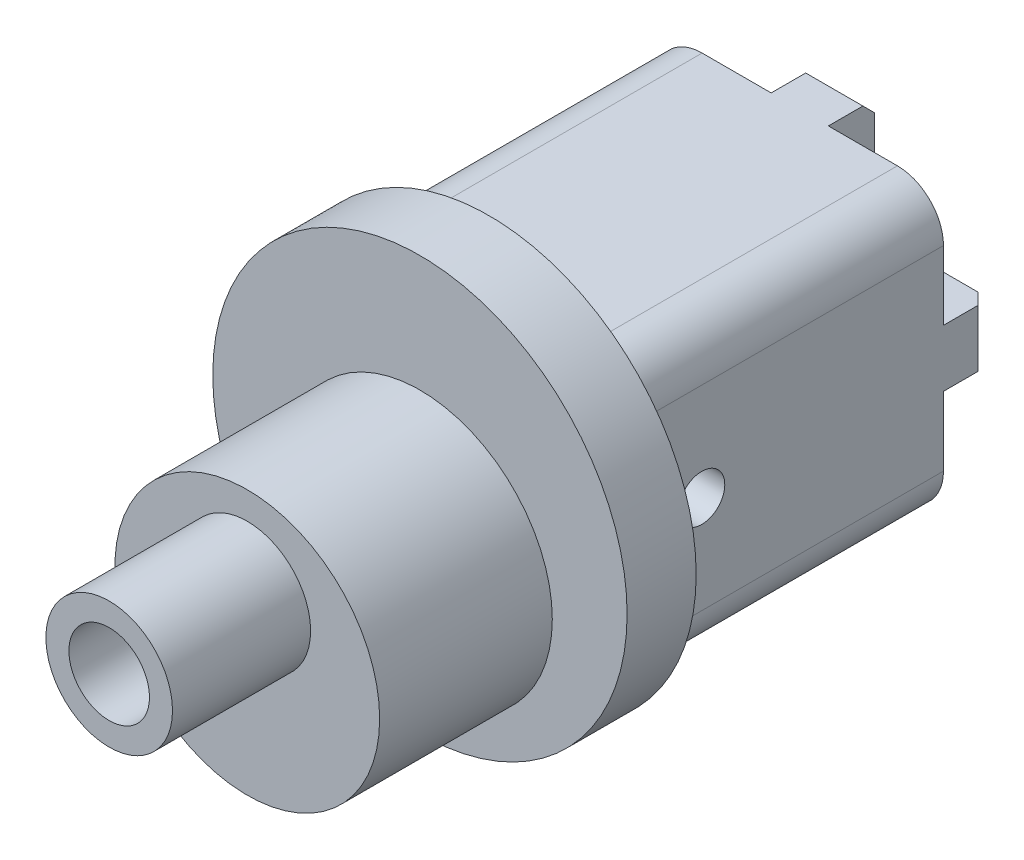
ISO-10303-21;
HEADER;
FILE_DESCRIPTION(('STEP AP214'),'2;1');
FILE_NAME('part.step','',(''),(''),'','','');
FILE_SCHEMA(('AUTOMOTIVE_DESIGN { 1 0 10303 214 1 1 1 1 }'));
ENDSEC;
DATA;
#1=APPLICATION_CONTEXT('core data for automotive mechanical design processes');
#2=APPLICATION_PROTOCOL_DEFINITION('international standard','automotive_design',2000,#1);
#3=PRODUCT_CONTEXT('',#1,'mechanical');
#4=PRODUCT('Part','Part','',(#3));
#5=PRODUCT_RELATED_PRODUCT_CATEGORY('part','',(#4));
#6=PRODUCT_DEFINITION_FORMATION('','',#4);
#7=PRODUCT_DEFINITION_CONTEXT('part definition',#1,'design');
#8=PRODUCT_DEFINITION('design','',#6,#7);
#9=PRODUCT_DEFINITION_SHAPE('','',#8);
#10=(LENGTH_UNIT() NAMED_UNIT(*) SI_UNIT(.MILLI.,.METRE.));
#11=(NAMED_UNIT(*) PLANE_ANGLE_UNIT() SI_UNIT($,.RADIAN.));
#12=(NAMED_UNIT(*) SI_UNIT($,.STERADIAN.) SOLID_ANGLE_UNIT());
#13=UNCERTAINTY_MEASURE_WITH_UNIT(LENGTH_MEASURE(1.E-05),#10,'distance_accuracy_value','');
#14=(GEOMETRIC_REPRESENTATION_CONTEXT(3) GLOBAL_UNCERTAINTY_ASSIGNED_CONTEXT((#13)) GLOBAL_UNIT_ASSIGNED_CONTEXT((#10,
#11,#12)) REPRESENTATION_CONTEXT('',''));
#15=CARTESIAN_POINT('',(0.,0.,0.));
#16=DIRECTION('',(0.,0.,1.));
#17=DIRECTION('',(1.,0.,0.));
#18=AXIS2_PLACEMENT_3D('',#15,#16,#17);
#19=CARTESIAN_POINT('',(0.,0.,2.));
#20=DIRECTION('',(0.,0.,1.));
#21=DIRECTION('',(1.,0.,0.));
#22=AXIS2_PLACEMENT_3D('',#19,#20,#21);
#23=PLANE('',#22);
#24=DIRECTION('',(-1.,0.,0.));
#25=VECTOR('',#24,1.);
#26=CARTESIAN_POINT('',(0.,-1.24264068719723,2.));
#27=LINE('',#26,#25);
#28=CARTESIAN_POINT('',(-4.24264068669562,-1.24264068719723,2.));
#29=VERTEX_POINT('',#28);
#30=CARTESIAN_POINT('',(-6.24264068701273,-1.24264068719723,2.));
#31=VERTEX_POINT('',#30);
#32=EDGE_CURVE('E605',#29,#31,#27,.T.);
#33=ORIENTED_EDGE('',*,*,#32,.F.);
#34=CARTESIAN_POINT('',(-4.24264068669562,-4.24264068701051,2.));
#35=DIRECTION('',(0.,0.,1.));
#36=DIRECTION('',(1.,0.,0.));
#37=AXIS2_PLACEMENT_3D('',#34,#35,#36);
#38=CIRCLE('',#37,2.99999999981328);
#39=CARTESIAN_POINT('',(-1.24264068688234,-4.24264068701051,2.));
#40=VERTEX_POINT('',#39);
#41=EDGE_CURVE('E602',#40,#29,#38,.T.);
#42=ORIENTED_EDGE('',*,*,#41,.F.);
#43=DIRECTION('',(0.,-1.,0.));
#44=VECTOR('',#43,1.);
#45=CARTESIAN_POINT('',(-1.24264068688233,0.,2.));
#46=LINE('',#45,#44);
#47=CARTESIAN_POINT('',(-1.24264068688234,-6.24264068669785,2.));
#48=VERTEX_POINT('',#47);
#49=EDGE_CURVE('E600',#40,#48,#46,.T.);
#50=ORIENTED_EDGE('',*,*,#49,.T.);
#51=DIRECTION('',(-1.,0.,0.));
#52=VECTOR('',#51,1.);
#53=CARTESIAN_POINT('',(0.,-6.24264068669785,2.));
#54=LINE('',#53,#52);
#55=CARTESIAN_POINT('',(-4.2426406870109,-6.24264068651041,2.));
#56=VERTEX_POINT('',#55);
#57=EDGE_CURVE('E378',#48,#56,#54,.T.);
#58=ORIENTED_EDGE('',*,*,#57,.T.);
#59=CARTESIAN_POINT('',(-4.2426406870109,-4.24264068669601,2.));
#60=DIRECTION('',(0.,0.,1.));
#61=DIRECTION('',(1.,0.,0.));
#62=AXIS2_PLACEMENT_3D('',#59,#60,#61);
#63=CIRCLE('',#62,1.99999999962697);
#64=CARTESIAN_POINT('',(-6.2426406868253,-4.24264068669601,2.));
#65=VERTEX_POINT('',#64);
#66=EDGE_CURVE('E375',#65,#56,#63,.T.);
#67=ORIENTED_EDGE('',*,*,#66,.F.);
#68=DIRECTION('',(0.,-1.,0.));
#69=VECTOR('',#68,1.);
#70=CARTESIAN_POINT('',(-6.24264068701273,0.,2.));
#71=LINE('',#70,#69);
#72=EDGE_CURVE('E352',#31,#65,#71,.T.);
#73=ORIENTED_EDGE('',*,*,#72,.F.);
#74=EDGE_LOOP('',(#33,#42,#50,#58,#67,#73));
#75=FACE_BOUND('',#74,.T.);
#76=ADVANCED_FACE('F65',(#75),#23,.F.);
#77=DIRECTION('',(0.,-1.,0.));
#78=VECTOR('',#77,1.);
#79=CARTESIAN_POINT('',(1.24264068719723,0.,2.));
#80=LINE('',#79,#78);
#81=CARTESIAN_POINT('',(1.24264068719723,-4.24264068669562,2.));
#82=VERTEX_POINT('',#81);
#83=CARTESIAN_POINT('',(1.24264068719723,-6.24264068669785,2.));
#84=VERTEX_POINT('',#83);
#85=EDGE_CURVE('E597',#82,#84,#80,.T.);
#86=ORIENTED_EDGE('',*,*,#85,.F.);
#87=CARTESIAN_POINT('',(4.24264068701051,-4.24264068669562,2.));
#88=DIRECTION('',(0.,0.,1.));
#89=DIRECTION('',(1.,0.,0.));
#90=AXIS2_PLACEMENT_3D('',#87,#88,#89);
#91=CIRCLE('',#90,2.99999999981328);
#92=CARTESIAN_POINT('',(4.24264068701051,-1.24264068688234,2.));
#93=VERTEX_POINT('',#92);
#94=EDGE_CURVE('E592',#93,#82,#91,.T.);
#95=ORIENTED_EDGE('',*,*,#94,.F.);
#96=DIRECTION('',(1.,0.,0.));
#97=VECTOR('',#96,1.);
#98=CARTESIAN_POINT('',(0.,-1.24264068688234,2.));
#99=LINE('',#98,#97);
#100=CARTESIAN_POINT('',(6.24264068669746,-1.24264068688234,2.));
#101=VERTEX_POINT('',#100);
#102=EDGE_CURVE('E590',#93,#101,#99,.T.);
#103=ORIENTED_EDGE('',*,*,#102,.T.);
#104=DIRECTION('',(0.,-1.,0.));
#105=VECTOR('',#104,1.);
#106=CARTESIAN_POINT('',(6.24264068669746,0.,2.));
#107=LINE('',#106,#105);
#108=CARTESIAN_POINT('',(6.24264068655586,-4.24264068669601,2.));
#109=VERTEX_POINT('',#108);
#110=EDGE_CURVE('E384',#101,#109,#107,.T.);
#111=ORIENTED_EDGE('',*,*,#110,.T.);
#112=CARTESIAN_POINT('',(4.24264068669562,-4.24264068669601,2.));
#113=DIRECTION('',(0.,0.,1.));
#114=DIRECTION('',(1.,0.,0.));
#115=AXIS2_PLACEMENT_3D('',#112,#113,#114);
#116=CIRCLE('',#115,1.99999999971864);
#117=CARTESIAN_POINT('',(4.24264068669562,-6.24264068655625,2.));
#118=VERTEX_POINT('',#117);
#119=EDGE_CURVE('E381',#118,#109,#116,.T.);
#120=ORIENTED_EDGE('',*,*,#119,.F.);
#121=EDGE_CURVE('E379',#118,#84,#54,.T.);
#122=ORIENTED_EDGE('',*,*,#121,.T.);
#123=EDGE_LOOP('',(#86,#95,#103,#111,#120,#122));
#124=FACE_BOUND('',#123,.T.);
#125=ADVANCED_FACE('F475',(#124),#23,.F.);
#126=DIRECTION('',(1.,0.,0.));
#127=VECTOR('',#126,1.);
#128=CARTESIAN_POINT('',(0.,1.24264068719723,2.));
#129=LINE('',#128,#127);
#130=CARTESIAN_POINT('',(4.24264068669562,1.24264068719723,2.));
#131=VERTEX_POINT('',#130);
#132=CARTESIAN_POINT('',(6.24264068669746,1.24264068719723,2.));
#133=VERTEX_POINT('',#132);
#134=EDGE_CURVE('E589',#131,#133,#129,.T.);
#135=ORIENTED_EDGE('',*,*,#134,.F.);
#136=CARTESIAN_POINT('',(4.24264068669562,4.24264068701051,2.));
#137=DIRECTION('',(0.,0.,1.));
#138=DIRECTION('',(1.,0.,0.));
#139=AXIS2_PLACEMENT_3D('',#136,#137,#138);
#140=CIRCLE('',#139,2.99999999981328);
#141=CARTESIAN_POINT('',(1.24264068688234,4.24264068701051,2.));
#142=VERTEX_POINT('',#141);
#143=EDGE_CURVE('E278',#142,#131,#140,.T.);
#144=ORIENTED_EDGE('',*,*,#143,.F.);
#145=DIRECTION('',(0.,1.,0.));
#146=VECTOR('',#145,1.);
#147=CARTESIAN_POINT('',(1.24264068688234,0.,2.));
#148=LINE('',#147,#146);
#149=CARTESIAN_POINT('',(1.24264068688234,6.24264068701235,2.));
#150=VERTEX_POINT('',#149);
#151=EDGE_CURVE('E275',#142,#150,#148,.T.);
#152=ORIENTED_EDGE('',*,*,#151,.T.);
#153=DIRECTION('',(-1.,0.,0.));
#154=VECTOR('',#153,1.);
#155=CARTESIAN_POINT('',(0.,6.24264068701235,2.));
#156=LINE('',#155,#154);
#157=CARTESIAN_POINT('',(4.24264068669562,6.24264068702136,2.));
#158=VERTEX_POINT('',#157);
#159=EDGE_CURVE('E261',#158,#150,#156,.T.);
#160=ORIENTED_EDGE('',*,*,#159,.F.);
#161=CARTESIAN_POINT('',(4.24264068669562,4.24264068701051,2.));
#162=DIRECTION('',(0.,0.,1.));
#163=DIRECTION('',(1.,0.,0.));
#164=AXIS2_PLACEMENT_3D('',#161,#162,#163);
#165=CIRCLE('',#164,2.00000000001987);
#166=CARTESIAN_POINT('',(6.24264068670647,4.24264068701051,2.));
#167=VERTEX_POINT('',#166);
#168=EDGE_CURVE('E262',#167,#158,#165,.T.);
#169=ORIENTED_EDGE('',*,*,#168,.F.);
#170=EDGE_CURVE('E385',#167,#133,#107,.T.);
#171=ORIENTED_EDGE('',*,*,#170,.T.);
#172=EDGE_LOOP('',(#135,#144,#152,#160,#169,#171));
#173=FACE_BOUND('',#172,.T.);
#174=ADVANCED_FACE('F481',(#173),#23,.F.);
#175=CARTESIAN_POINT('',(0.,0.,18.5));
#176=DIRECTION('',(0.,0.,-1.));
#177=DIRECTION('',(-1.,0.,0.));
#178=AXIS2_PLACEMENT_3D('',#175,#176,#177);
#179=CYLINDRICAL_SURFACE('',#178,9.);
#180=CARTESIAN_POINT('',(0.,0.,18.5));
#181=DIRECTION('',(0.,0.,1.));
#182=DIRECTION('',(1.,0.,0.));
#183=AXIS2_PLACEMENT_3D('',#180,#181,#182);
#184=CIRCLE('',#183,9.);
#185=CARTESIAN_POINT('',(9.,0.,18.5));
#186=VERTEX_POINT('',#185);
#187=EDGE_CURVE('E424',#186,#186,#184,.T.);
#188=ORIENTED_EDGE('',*,*,#187,.F.);
#189=EDGE_LOOP('',(#188));
#190=FACE_BOUND('',#189,.T.);
#191=CARTESIAN_POINT('',(0.,0.,15.5));
#192=DIRECTION('',(0.,0.,1.));
#193=DIRECTION('',(1.,0.,0.));
#194=AXIS2_PLACEMENT_3D('',#191,#192,#193);
#195=CIRCLE('',#194,9.);
#196=CARTESIAN_POINT('',(9.,0.,15.5));
#197=VERTEX_POINT('',#196);
#198=EDGE_CURVE('E421',#197,#197,#195,.T.);
#199=ORIENTED_EDGE('',*,*,#198,.T.);
#200=EDGE_LOOP('',(#199));
#201=FACE_BOUND('',#200,.T.);
#202=ADVANCED_FACE('F499',(#190,#201),#179,.T.);
#203=CARTESIAN_POINT('',(0.,0.,18.5));
#204=DIRECTION('',(0.,0.,1.));
#205=DIRECTION('',(1.,0.,0.));
#206=AXIS2_PLACEMENT_3D('',#203,#204,#205);
#207=PLANE('',#206);
#208=CARTESIAN_POINT('',(0.,-1.812,18.5));
#209=DIRECTION('',(0.,0.,1.));
#210=DIRECTION('',(1.,0.,0.));
#211=AXIS2_PLACEMENT_3D('',#208,#209,#210);
#212=CIRCLE('',#211,5.75);
#213=CARTESIAN_POINT('',(5.75,-1.812,18.5));
#214=VERTEX_POINT('',#213);
#215=EDGE_CURVE('E418',#214,#214,#212,.T.);
#216=ORIENTED_EDGE('',*,*,#215,.F.);
#217=EDGE_LOOP('',(#216));
#218=FACE_BOUND('',#217,.T.);
#219=ORIENTED_EDGE('',*,*,#187,.T.);
#220=EDGE_LOOP('',(#219));
#221=FACE_BOUND('',#220,.T.);
#222=ADVANCED_FACE('F543',(#218,#221),#207,.T.);
#223=CARTESIAN_POINT('',(0.,0.,15.5));
#224=DIRECTION('',(0.,0.,1.));
#225=DIRECTION('',(1.,0.,0.));
#226=AXIS2_PLACEMENT_3D('',#223,#224,#225);
#227=PLANE('',#226);
#228=DIRECTION('',(0.,-1.,0.));
#229=VECTOR('',#228,1.);
#230=CARTESIAN_POINT('',(6.24264068669746,0.,15.5));
#231=LINE('',#230,#229);
#232=CARTESIAN_POINT('',(6.24264068670647,4.24264068701051,15.5));
#233=VERTEX_POINT('',#232);
#234=CARTESIAN_POINT('',(6.24264068655586,-4.24264068669601,15.5));
#235=VERTEX_POINT('',#234);
#236=EDGE_CURVE('E362',#233,#235,#231,.T.);
#237=ORIENTED_EDGE('',*,*,#236,.F.);
#238=CARTESIAN_POINT('',(4.24264068669562,4.24264068701051,15.5));
#239=DIRECTION('',(0.,0.,1.));
#240=DIRECTION('',(1.,0.,0.));
#241=AXIS2_PLACEMENT_3D('',#238,#239,#240);
#242=CIRCLE('',#241,2.00000000001987);
#243=CARTESIAN_POINT('',(4.24264068669562,6.24264068702136,15.5));
#244=VERTEX_POINT('',#243);
#245=EDGE_CURVE('E365',#233,#244,#242,.T.);
#246=ORIENTED_EDGE('',*,*,#245,.T.);
#247=DIRECTION('',(-1.,0.,0.));
#248=VECTOR('',#247,1.);
#249=CARTESIAN_POINT('',(0.,6.24264068701235,15.5));
#250=LINE('',#249,#248);
#251=CARTESIAN_POINT('',(-4.2426406870109,6.2426406869755,15.5));
#252=VERTEX_POINT('',#251);
#253=EDGE_CURVE('E367',#244,#252,#250,.T.);
#254=ORIENTED_EDGE('',*,*,#253,.T.);
#255=CARTESIAN_POINT('',(-4.2426406870109,4.24264068701051,15.5));
#256=DIRECTION('',(0.,0.,1.));
#257=DIRECTION('',(1.,0.,0.));
#258=AXIS2_PLACEMENT_3D('',#255,#256,#257);
#259=CIRCLE('',#258,1.99999999992815);
#260=CARTESIAN_POINT('',(-6.24264068697589,4.24264068701051,15.5));
#261=VERTEX_POINT('',#260);
#262=EDGE_CURVE('E369',#252,#261,#259,.T.);
#263=ORIENTED_EDGE('',*,*,#262,.T.);
#264=DIRECTION('',(0.,-1.,0.));
#265=VECTOR('',#264,1.);
#266=CARTESIAN_POINT('',(-6.24264068701273,0.,15.5));
#267=LINE('',#266,#265);
#268=CARTESIAN_POINT('',(-6.2426406868253,-4.24264068669601,15.5));
#269=VERTEX_POINT('',#268);
#270=EDGE_CURVE('E353',#261,#269,#267,.T.);
#271=ORIENTED_EDGE('',*,*,#270,.T.);
#272=CARTESIAN_POINT('',(-4.2426406870109,-4.24264068669601,15.5));
#273=DIRECTION('',(0.,0.,1.));
#274=DIRECTION('',(1.,0.,0.));
#275=AXIS2_PLACEMENT_3D('',#272,#273,#274);
#276=CIRCLE('',#275,1.99999999962697);
#277=CARTESIAN_POINT('',(-4.2426406870109,-6.24264068651041,15.5));
#278=VERTEX_POINT('',#277);
#279=EDGE_CURVE('E355',#269,#278,#276,.T.);
#280=ORIENTED_EDGE('',*,*,#279,.T.);
#281=DIRECTION('',(-1.,0.,0.));
#282=VECTOR('',#281,1.);
#283=CARTESIAN_POINT('',(0.,-6.24264068669785,15.5));
#284=LINE('',#283,#282);
#285=CARTESIAN_POINT('',(4.24264068669562,-6.24264068655625,15.5));
#286=VERTEX_POINT('',#285);
#287=EDGE_CURVE('E357',#286,#278,#284,.T.);
#288=ORIENTED_EDGE('',*,*,#287,.F.);
#289=CARTESIAN_POINT('',(4.24264068669562,-4.24264068669601,15.5));
#290=DIRECTION('',(0.,0.,1.));
#291=DIRECTION('',(1.,0.,0.));
#292=AXIS2_PLACEMENT_3D('',#289,#290,#291);
#293=CIRCLE('',#292,1.99999999971864);
#294=EDGE_CURVE('E360',#286,#235,#293,.T.);
#295=ORIENTED_EDGE('',*,*,#294,.T.);
#296=EDGE_LOOP('',(#237,#246,#254,#263,#271,#280,#288,#295));
#297=FACE_BOUND('',#296,.T.);
#298=ORIENTED_EDGE('',*,*,#198,.F.);
#299=EDGE_LOOP('',(#298));
#300=FACE_BOUND('',#299,.T.);
#301=ADVANCED_FACE('F541',(#297,#300),#227,.F.);
#302=CARTESIAN_POINT('',(0.,-1.812,26.));
#303=DIRECTION('',(0.,0.,-1.));
#304=DIRECTION('',(-1.,0.,0.));
#305=AXIS2_PLACEMENT_3D('',#302,#303,#304);
#306=CYLINDRICAL_SURFACE('',#305,5.75);
#307=CARTESIAN_POINT('',(0.,-1.812,26.));
#308=DIRECTION('',(0.,0.,1.));
#309=DIRECTION('',(1.,0.,0.));
#310=AXIS2_PLACEMENT_3D('',#307,#308,#309);
#311=CIRCLE('',#310,5.75);
#312=CARTESIAN_POINT('',(5.75,-1.812,26.));
#313=VERTEX_POINT('',#312);
#314=EDGE_CURVE('E413',#313,#313,#311,.T.);
#315=ORIENTED_EDGE('',*,*,#314,.F.);
#316=EDGE_LOOP('',(#315));
#317=FACE_BOUND('',#316,.T.);
#318=ORIENTED_EDGE('',*,*,#215,.T.);
#319=EDGE_LOOP('',(#318));
#320=FACE_BOUND('',#319,.T.);
#321=ADVANCED_FACE('F537',(#317,#320),#306,.T.);
#322=CARTESIAN_POINT('',(0.,-1.812,26.));
#323=DIRECTION('',(0.,0.,1.));
#324=DIRECTION('',(1.,0.,0.));
#325=AXIS2_PLACEMENT_3D('',#322,#323,#324);
#326=PLANE('',#325);
#327=CARTESIAN_POINT('',(0.,0.,26.));
#328=DIRECTION('',(0.,0.,1.));
#329=DIRECTION('',(1.,0.,0.));
#330=AXIS2_PLACEMENT_3D('',#327,#328,#329);
#331=CIRCLE('',#330,2.75);
#332=CARTESIAN_POINT('',(2.75,0.,26.));
#333=VERTEX_POINT('',#332);
#334=EDGE_CURVE('E414',#333,#333,#331,.T.);
#335=ORIENTED_EDGE('',*,*,#334,.F.);
#336=EDGE_LOOP('',(#335));
#337=FACE_BOUND('',#336,.T.);
#338=ORIENTED_EDGE('',*,*,#314,.T.);
#339=EDGE_LOOP('',(#338));
#340=FACE_BOUND('',#339,.T.);
#341=ADVANCED_FACE('F533',(#337,#340),#326,.T.);
#342=CARTESIAN_POINT('',(0.,0.,32.));
#343=DIRECTION('',(0.,0.,-1.));
#344=DIRECTION('',(-1.,0.,0.));
#345=AXIS2_PLACEMENT_3D('',#342,#343,#344);
#346=CYLINDRICAL_SURFACE('',#345,2.75);
#347=CARTESIAN_POINT('',(0.,0.,32.));
#348=DIRECTION('',(0.,0.,1.));
#349=DIRECTION('',(1.,0.,0.));
#350=AXIS2_PLACEMENT_3D('',#347,#348,#349);
#351=CIRCLE('',#350,2.75);
#352=CARTESIAN_POINT('',(2.75,0.,32.));
#353=VERTEX_POINT('',#352);
#354=EDGE_CURVE('E410',#353,#353,#351,.T.);
#355=ORIENTED_EDGE('',*,*,#354,.F.);
#356=EDGE_LOOP('',(#355));
#357=FACE_BOUND('',#356,.T.);
#358=ORIENTED_EDGE('',*,*,#334,.T.);
#359=EDGE_LOOP('',(#358));
#360=FACE_BOUND('',#359,.T.);
#361=ADVANCED_FACE('F495',(#357,#360),#346,.T.);
#362=CARTESIAN_POINT('',(0.,0.,32.));
#363=DIRECTION('',(0.,0.,1.));
#364=DIRECTION('',(1.,0.,0.));
#365=AXIS2_PLACEMENT_3D('',#362,#363,#364);
#366=PLANE('',#365);
#367=CARTESIAN_POINT('',(0.,0.,32.));
#368=DIRECTION('',(0.,0.,1.));
#369=DIRECTION('',(1.,0.,0.));
#370=AXIS2_PLACEMENT_3D('',#367,#368,#369);
#371=CIRCLE('',#370,1.75);
#372=CARTESIAN_POINT('',(1.75,0.,32.));
#373=VERTEX_POINT('',#372);
#374=EDGE_CURVE('E617',#373,#373,#371,.T.);
#375=ORIENTED_EDGE('',*,*,#374,.F.);
#376=EDGE_LOOP('',(#375));
#377=FACE_BOUND('',#376,.T.);
#378=ORIENTED_EDGE('',*,*,#354,.T.);
#379=EDGE_LOOP('',(#378));
#380=FACE_BOUND('',#379,.T.);
#381=ADVANCED_FACE('F487',(#377,#380),#366,.T.);
#382=CARTESIAN_POINT('',(-4.24264068701051,4.24264068669562,2.));
#383=DIRECTION('',(0.,0.,1.));
#384=DIRECTION('',(1.,0.,0.));
#385=AXIS2_PLACEMENT_3D('',#382,#383,#384);
#386=CIRCLE('',#385,2.99999999981328);
#387=CARTESIAN_POINT('',(-4.24264068701051,1.24264068688234,2.));
#388=VERTEX_POINT('',#387);
#389=CARTESIAN_POINT('',(-1.24264068719723,4.24264068669562,2.));
#390=VERTEX_POINT('',#389);
#391=EDGE_CURVE('E317',#388,#390,#386,.T.);
#392=ORIENTED_EDGE('',*,*,#391,.F.);
#393=DIRECTION('',(-1.,0.,0.));
#394=VECTOR('',#393,1.);
#395=CARTESIAN_POINT('',(0.,1.24264068688234,2.));
#396=LINE('',#395,#394);
#397=CARTESIAN_POINT('',(-6.24264068701273,1.24264068688234,2.));
#398=VERTEX_POINT('',#397);
#399=EDGE_CURVE('E608',#388,#398,#396,.T.);
#400=ORIENTED_EDGE('',*,*,#399,.T.);
#401=CARTESIAN_POINT('',(-6.24264068697589,4.24264068701051,2.));
#402=VERTEX_POINT('',#401);
#403=EDGE_CURVE('E372',#402,#398,#71,.T.);
#404=ORIENTED_EDGE('',*,*,#403,.F.);
#405=CARTESIAN_POINT('',(-4.2426406870109,4.24264068701051,2.));
#406=DIRECTION('',(0.,0.,1.));
#407=DIRECTION('',(1.,0.,0.));
#408=AXIS2_PLACEMENT_3D('',#405,#406,#407);
#409=CIRCLE('',#408,1.99999999992815);
#410=CARTESIAN_POINT('',(-4.2426406870109,6.2426406869755,2.));
#411=VERTEX_POINT('',#410);
#412=EDGE_CURVE('E257',#411,#402,#409,.T.);
#413=ORIENTED_EDGE('',*,*,#412,.F.);
#414=CARTESIAN_POINT('',(-1.24264068719723,6.24264068701235,2.));
#415=VERTEX_POINT('',#414);
#416=EDGE_CURVE('E250',#415,#411,#156,.T.);
#417=ORIENTED_EDGE('',*,*,#416,.F.);
#418=DIRECTION('',(0.,1.,0.));
#419=VECTOR('',#418,1.);
#420=CARTESIAN_POINT('',(-1.24264068719723,0.,2.));
#421=LINE('',#420,#419);
#422=EDGE_CURVE('E254',#390,#415,#421,.T.);
#423=ORIENTED_EDGE('',*,*,#422,.F.);
#424=EDGE_LOOP('',(#392,#400,#404,#413,#417,#423));
#425=FACE_BOUND('',#424,.T.);
#426=ADVANCED_FACE('F252',(#425),#23,.F.);
#427=CARTESIAN_POINT('',(4.24264068669562,4.24264068701051,15.5));
#428=DIRECTION('',(0.,0.,-1.));
#429=DIRECTION('',(-1.,0.,0.));
#430=AXIS2_PLACEMENT_3D('',#427,#428,#429);
#431=CYLINDRICAL_SURFACE('',#430,2.00000000001987);
#432=ORIENTED_EDGE('',*,*,#168,.T.);
#433=DIRECTION('',(0.,0.,-1.));
#434=VECTOR('',#433,1.);
#435=CARTESIAN_POINT('',(4.24264068669562,6.24264068702136,15.5));
#436=LINE('',#435,#434);
#437=EDGE_CURVE('E395',#244,#158,#436,.T.);
#438=ORIENTED_EDGE('',*,*,#437,.F.);
#439=ORIENTED_EDGE('',*,*,#245,.F.);
#440=DIRECTION('',(0.,0.,-1.));
#441=VECTOR('',#440,1.);
#442=CARTESIAN_POINT('',(6.24264068670647,4.24264068701051,15.5));
#443=LINE('',#442,#441);
#444=EDGE_CURVE('E397',#233,#167,#443,.T.);
#445=ORIENTED_EDGE('',*,*,#444,.T.);
#446=EDGE_LOOP('',(#432,#438,#439,#445));
#447=FACE_BOUND('',#446,.T.);
#448=ADVANCED_FACE('F486',(#447),#431,.T.);
#449=CARTESIAN_POINT('',(0.,6.24264068701235,15.5));
#450=DIRECTION('',(0.,-1.,0.));
#451=DIRECTION('',(1.,0.,0.));
#452=AXIS2_PLACEMENT_3D('',#449,#450,#451);
#453=PLANE('',#452);
#454=DIRECTION('',(0.,0.,-1.));
#455=VECTOR('',#454,1.);
#456=CARTESIAN_POINT('',(1.24264068688234,6.24264068701235,2.));
#457=LINE('',#456,#455);
#458=CARTESIAN_POINT('',(1.24264068688234,6.24264068701235,0.499999999999997));
#459=VERTEX_POINT('',#458);
#460=EDGE_CURVE('E269',#150,#459,#457,.T.);
#461=ORIENTED_EDGE('',*,*,#460,.T.);
#462=DIRECTION('',(-1.,0.,0.));
#463=VECTOR('',#462,1.);
#464=CARTESIAN_POINT('',(0.,6.24264068701235,0.499999999999997));
#465=LINE('',#464,#463);
#466=CARTESIAN_POINT('',(-1.24264068719723,6.24264068701235,0.499999999999997));
#467=VERTEX_POINT('',#466);
#468=EDGE_CURVE('E267',#459,#467,#465,.T.);
#469=ORIENTED_EDGE('',*,*,#468,.T.);
#470=DIRECTION('',(0.,0.,-1.));
#471=VECTOR('',#470,1.);
#472=CARTESIAN_POINT('',(-1.24264068719723,6.24264068701235,2.));
#473=LINE('',#472,#471);
#474=EDGE_CURVE('E265',#415,#467,#473,.T.);
#475=ORIENTED_EDGE('',*,*,#474,.F.);
#476=ORIENTED_EDGE('',*,*,#416,.T.);
#477=DIRECTION('',(0.,0.,-1.));
#478=VECTOR('',#477,1.);
#479=CARTESIAN_POINT('',(-4.2426406870109,6.2426406869755,15.5));
#480=LINE('',#479,#478);
#481=EDGE_CURVE('E393',#252,#411,#480,.T.);
#482=ORIENTED_EDGE('',*,*,#481,.F.);
#483=ORIENTED_EDGE('',*,*,#253,.F.);
#484=ORIENTED_EDGE('',*,*,#437,.T.);
#485=ORIENTED_EDGE('',*,*,#159,.T.);
#486=EDGE_LOOP('',(#461,#469,#475,#476,#482,#483,#484,#485));
#487=FACE_BOUND('',#486,.T.);
#488=ADVANCED_FACE('F266',(#487),#453,.F.);
#489=CARTESIAN_POINT('',(-4.2426406870109,4.24264068701051,15.5));
#490=DIRECTION('',(0.,0.,-1.));
#491=DIRECTION('',(-1.,0.,0.));
#492=AXIS2_PLACEMENT_3D('',#489,#490,#491);
#493=CYLINDRICAL_SURFACE('',#492,1.99999999992815);
#494=ORIENTED_EDGE('',*,*,#412,.T.);
#495=DIRECTION('',(0.,0.,-1.));
#496=VECTOR('',#495,1.);
#497=CARTESIAN_POINT('',(-6.24264068697589,4.24264068701051,15.5));
#498=LINE('',#497,#496);
#499=EDGE_CURVE('E371',#261,#402,#498,.T.);
#500=ORIENTED_EDGE('',*,*,#499,.F.);
#501=ORIENTED_EDGE('',*,*,#262,.F.);
#502=ORIENTED_EDGE('',*,*,#481,.T.);
#503=EDGE_LOOP('',(#494,#500,#501,#502));
#504=FACE_BOUND('',#503,.T.);
#505=ADVANCED_FACE('F502',(#504),#493,.T.);
#506=CARTESIAN_POINT('',(-6.24264068701273,0.,15.5));
#507=DIRECTION('',(1.,0.,0.));
#508=DIRECTION('',(0.,1.,0.));
#509=AXIS2_PLACEMENT_3D('',#506,#507,#508);
#510=PLANE('',#509);
#511=CARTESIAN_POINT('',(-6.24264068701273,0.,12.5));
#512=DIRECTION('',(1.,0.,0.));
#513=DIRECTION('',(0.,1.,0.));
#514=AXIS2_PLACEMENT_3D('',#511,#512,#513);
#515=CIRCLE('',#514,1.);
#516=CARTESIAN_POINT('',(-6.24264068701273,1.,12.5));
#517=VERTEX_POINT('',#516);
#518=EDGE_CURVE('E286',#517,#517,#515,.T.);
#519=ORIENTED_EDGE('',*,*,#518,.T.);
#520=EDGE_LOOP('',(#519));
#521=FACE_BOUND('',#520,.T.);
#522=DIRECTION('',(0.,0.,-1.));
#523=VECTOR('',#522,1.);
#524=CARTESIAN_POINT('',(-6.24264068701273,1.24264068688234,2.));
#525=LINE('',#524,#523);
#526=CARTESIAN_POINT('',(-6.24264068701273,1.24264068688234,0.499999999999997));
#527=VERTEX_POINT('',#526);
#528=EDGE_CURVE('E347',#398,#527,#525,.T.);
#529=ORIENTED_EDGE('',*,*,#528,.T.);
#530=DIRECTION('',(0.,-1.,0.));
#531=VECTOR('',#530,1.);
#532=CARTESIAN_POINT('',(-6.24264068701273,0.,0.499999999999997));
#533=LINE('',#532,#531);
#534=CARTESIAN_POINT('',(-6.24264068701273,-1.24264068719723,0.499999999999997));
#535=VERTEX_POINT('',#534);
#536=EDGE_CURVE('E450',#527,#535,#533,.T.);
#537=ORIENTED_EDGE('',*,*,#536,.T.);
#538=DIRECTION('',(0.,0.,-1.));
#539=VECTOR('',#538,1.);
#540=CARTESIAN_POINT('',(-6.24264068701273,-1.24264068719723,2.));
#541=LINE('',#540,#539);
#542=EDGE_CURVE('E344',#31,#535,#541,.T.);
#543=ORIENTED_EDGE('',*,*,#542,.F.);
#544=ORIENTED_EDGE('',*,*,#72,.T.);
#545=DIRECTION('',(0.,0.,-1.));
#546=VECTOR('',#545,1.);
#547=CARTESIAN_POINT('',(-6.2426406868253,-4.24264068669601,15.5));
#548=LINE('',#547,#546);
#549=EDGE_CURVE('E407',#269,#65,#548,.T.);
#550=ORIENTED_EDGE('',*,*,#549,.F.);
#551=ORIENTED_EDGE('',*,*,#270,.F.);
#552=ORIENTED_EDGE('',*,*,#499,.T.);
#553=ORIENTED_EDGE('',*,*,#403,.T.);
#554=EDGE_LOOP('',(#529,#537,#543,#544,#550,#551,#552,#553));
#555=FACE_BOUND('',#554,.T.);
#556=ADVANCED_FACE('F509',(#521,#555),#510,.F.);
#557=CARTESIAN_POINT('',(-4.2426406870109,-4.24264068669601,15.5));
#558=DIRECTION('',(0.,0.,-1.));
#559=DIRECTION('',(-1.,0.,0.));
#560=AXIS2_PLACEMENT_3D('',#557,#558,#559);
#561=CYLINDRICAL_SURFACE('',#560,1.99999999962697);
#562=ORIENTED_EDGE('',*,*,#66,.T.);
#563=DIRECTION('',(0.,0.,-1.));
#564=VECTOR('',#563,1.);
#565=CARTESIAN_POINT('',(-4.2426406870109,-6.24264068651041,15.5));
#566=LINE('',#565,#564);
#567=EDGE_CURVE('E404',#278,#56,#566,.T.);
#568=ORIENTED_EDGE('',*,*,#567,.F.);
#569=ORIENTED_EDGE('',*,*,#279,.F.);
#570=ORIENTED_EDGE('',*,*,#549,.T.);
#571=EDGE_LOOP('',(#562,#568,#569,#570));
#572=FACE_BOUND('',#571,.T.);
#573=ADVANCED_FACE('F524',(#572),#561,.T.);
#574=CARTESIAN_POINT('',(0.,-6.24264068669785,15.5));
#575=DIRECTION('',(0.,-1.,0.));
#576=DIRECTION('',(1.,0.,0.));
#577=AXIS2_PLACEMENT_3D('',#574,#575,#576);
#578=PLANE('',#577);
#579=DIRECTION('',(0.,0.,-1.));
#580=VECTOR('',#579,1.);
#581=CARTESIAN_POINT('',(-1.24264068688234,-6.24264068669785,2.));
#582=LINE('',#581,#580);
#583=CARTESIAN_POINT('',(-1.24264068688234,-6.24264068669785,0.5));
#584=VERTEX_POINT('',#583);
#585=EDGE_CURVE('E337',#48,#584,#582,.T.);
#586=ORIENTED_EDGE('',*,*,#585,.T.);
#587=DIRECTION('',(1.,0.,0.));
#588=VECTOR('',#587,1.);
#589=CARTESIAN_POINT('',(1.24264068719723,-6.24264068669785,0.5));
#590=LINE('',#589,#588);
#591=CARTESIAN_POINT('',(1.24264068719723,-6.24264068669785,0.5));
#592=VERTEX_POINT('',#591);
#593=EDGE_CURVE('E440',#584,#592,#590,.T.);
#594=ORIENTED_EDGE('',*,*,#593,.T.);
#595=DIRECTION('',(0.,0.,-1.));
#596=VECTOR('',#595,1.);
#597=CARTESIAN_POINT('',(1.24264068719723,-6.24264068669785,2.));
#598=LINE('',#597,#596);
#599=EDGE_CURVE('E334',#84,#592,#598,.T.);
#600=ORIENTED_EDGE('',*,*,#599,.F.);
#601=ORIENTED_EDGE('',*,*,#121,.F.);
#602=DIRECTION('',(0.,0.,-1.));
#603=VECTOR('',#602,1.);
#604=CARTESIAN_POINT('',(4.24264068669562,-6.24264068655625,15.5));
#605=LINE('',#604,#603);
#606=EDGE_CURVE('E402',#286,#118,#605,.T.);
#607=ORIENTED_EDGE('',*,*,#606,.F.);
#608=ORIENTED_EDGE('',*,*,#287,.T.);
#609=ORIENTED_EDGE('',*,*,#567,.T.);
#610=ORIENTED_EDGE('',*,*,#57,.F.);
#611=EDGE_LOOP('',(#586,#594,#600,#601,#607,#608,#609,#610));
#612=FACE_BOUND('',#611,.T.);
#613=ADVANCED_FACE('F520',(#612),#578,.T.);
#614=CARTESIAN_POINT('',(4.24264068669562,-4.24264068669601,15.5));
#615=DIRECTION('',(0.,0.,-1.));
#616=DIRECTION('',(-1.,0.,0.));
#617=AXIS2_PLACEMENT_3D('',#614,#615,#616);
#618=CYLINDRICAL_SURFACE('',#617,1.99999999971864);
#619=ORIENTED_EDGE('',*,*,#119,.T.);
#620=DIRECTION('',(0.,0.,-1.));
#621=VECTOR('',#620,1.);
#622=CARTESIAN_POINT('',(6.24264068655586,-4.24264068669601,15.5));
#623=LINE('',#622,#621);
#624=EDGE_CURVE('E399',#235,#109,#623,.T.);
#625=ORIENTED_EDGE('',*,*,#624,.F.);
#626=ORIENTED_EDGE('',*,*,#294,.F.);
#627=ORIENTED_EDGE('',*,*,#606,.T.);
#628=EDGE_LOOP('',(#619,#625,#626,#627));
#629=FACE_BOUND('',#628,.T.);
#630=ADVANCED_FACE('F516',(#629),#618,.T.);
#631=CARTESIAN_POINT('',(6.24264068669746,0.,15.5));
#632=DIRECTION('',(1.,0.,0.));
#633=DIRECTION('',(0.,1.,0.));
#634=AXIS2_PLACEMENT_3D('',#631,#632,#633);
#635=PLANE('',#634);
#636=CARTESIAN_POINT('',(6.24264068669746,0.,12.5));
#637=DIRECTION('',(1.,0.,0.));
#638=DIRECTION('',(0.,1.,0.));
#639=AXIS2_PLACEMENT_3D('',#636,#637,#638);
#640=CIRCLE('',#639,1.);
#641=CARTESIAN_POINT('',(6.24264068669746,0.999999999999999,12.5));
#642=VERTEX_POINT('',#641);
#643=EDGE_CURVE('E613',#642,#642,#640,.T.);
#644=ORIENTED_EDGE('',*,*,#643,.F.);
#645=EDGE_LOOP('',(#644));
#646=FACE_BOUND('',#645,.T.);
#647=DIRECTION('',(0.,0.,-1.));
#648=VECTOR('',#647,1.);
#649=CARTESIAN_POINT('',(6.24264068669746,-1.24264068688234,2.));
#650=LINE('',#649,#648);
#651=CARTESIAN_POINT('',(6.24264068669746,-1.24264068688234,0.5));
#652=VERTEX_POINT('',#651);
#653=EDGE_CURVE('E327',#101,#652,#650,.T.);
#654=ORIENTED_EDGE('',*,*,#653,.T.);
#655=DIRECTION('',(0.,1.,0.));
#656=VECTOR('',#655,1.);
#657=CARTESIAN_POINT('',(6.24264068669746,1.24264068719723,0.5));
#658=LINE('',#657,#656);
#659=CARTESIAN_POINT('',(6.24264068669746,1.24264068719723,0.5));
#660=VERTEX_POINT('',#659);
#661=EDGE_CURVE('E446',#652,#660,#658,.T.);
#662=ORIENTED_EDGE('',*,*,#661,.T.);
#663=DIRECTION('',(0.,0.,-1.));
#664=VECTOR('',#663,1.);
#665=CARTESIAN_POINT('',(6.24264068669746,1.24264068719723,2.));
#666=LINE('',#665,#664);
#667=EDGE_CURVE('E324',#133,#660,#666,.T.);
#668=ORIENTED_EDGE('',*,*,#667,.F.);
#669=ORIENTED_EDGE('',*,*,#170,.F.);
#670=ORIENTED_EDGE('',*,*,#444,.F.);
#671=ORIENTED_EDGE('',*,*,#236,.T.);
#672=ORIENTED_EDGE('',*,*,#624,.T.);
#673=ORIENTED_EDGE('',*,*,#110,.F.);
#674=EDGE_LOOP('',(#654,#662,#668,#669,#670,#671,#672,#673));
#675=FACE_BOUND('',#674,.T.);
#676=ADVANCED_FACE('F512',(#646,#675),#635,.T.);
#677=CARTESIAN_POINT('',(-4.24264068701051,4.24264068669562,2.));
#678=DIRECTION('',(0.,0.,-1.));
#679=DIRECTION('',(-1.,0.,0.));
#680=AXIS2_PLACEMENT_3D('',#677,#678,#679);
#681=CYLINDRICAL_SURFACE('',#680,2.99999999981328);
#682=CARTESIAN_POINT('',(-4.24264068701051,4.24264068669562,0.));
#683=DIRECTION('',(0.,0.,1.));
#684=DIRECTION('',(1.,0.,0.));
#685=AXIS2_PLACEMENT_3D('',#682,#683,#684);
#686=CIRCLE('',#685,2.99999999981328);
#687=CARTESIAN_POINT('',(-4.24264068701051,1.24264068688234,0.));
#688=VERTEX_POINT('',#687);
#689=CARTESIAN_POINT('',(-1.24264068719723,4.24264068669562,0.));
#690=VERTEX_POINT('',#689);
#691=EDGE_CURVE('E282',#688,#690,#686,.T.);
#692=ORIENTED_EDGE('',*,*,#691,.F.);
#693=DIRECTION('',(0.,0.,-1.));
#694=VECTOR('',#693,1.);
#695=CARTESIAN_POINT('',(-4.24264068701051,1.24264068688234,2.));
#696=LINE('',#695,#694);
#697=EDGE_CURVE('E350',#388,#688,#696,.T.);
#698=ORIENTED_EDGE('',*,*,#697,.F.);
#699=ORIENTED_EDGE('',*,*,#391,.T.);
#700=DIRECTION('',(0.,0.,-1.));
#701=VECTOR('',#700,1.);
#702=CARTESIAN_POINT('',(-1.24264068719723,4.24264068669562,2.));
#703=LINE('',#702,#701);
#704=EDGE_CURVE('E270',#390,#690,#703,.T.);
#705=ORIENTED_EDGE('',*,*,#704,.T.);
#706=EDGE_LOOP('',(#692,#698,#699,#705));
#707=FACE_BOUND('',#706,.T.);
#708=ADVANCED_FACE('F515',(#707),#681,.F.);
#709=CARTESIAN_POINT('',(0.,1.24264068688234,2.));
#710=DIRECTION('',(0.,-1.,0.));
#711=DIRECTION('',(1.,0.,0.));
#712=AXIS2_PLACEMENT_3D('',#709,#710,#711);
#713=PLANE('',#712);
#714=DIRECTION('',(-1.,0.,0.));
#715=VECTOR('',#714,1.);
#716=CARTESIAN_POINT('',(0.,1.24264068688234,0.));
#717=LINE('',#716,#715);
#718=CARTESIAN_POINT('',(-5.74264068701273,1.24264068688234,0.));
#719=VERTEX_POINT('',#718);
#720=EDGE_CURVE('E285',#688,#719,#717,.T.);
#721=ORIENTED_EDGE('',*,*,#720,.T.);
#722=DIRECTION('',(0.70710678118655,0.,-0.707106781186545));
#723=VECTOR('',#722,1.);
#724=CARTESIAN_POINT('',(-6.24264068701273,1.24264068688234,0.499999999999997));
#725=LINE('',#724,#723);
#726=EDGE_CURVE('E455',#719,#527,#725,.F.);
#727=ORIENTED_EDGE('',*,*,#726,.T.);
#728=ORIENTED_EDGE('',*,*,#528,.F.);
#729=ORIENTED_EDGE('',*,*,#399,.F.);
#730=ORIENTED_EDGE('',*,*,#697,.T.);
#731=EDGE_LOOP('',(#721,#727,#728,#729,#730));
#732=FACE_BOUND('',#731,.T.);
#733=ADVANCED_FACE('F680',(#732),#713,.F.);
#734=CARTESIAN_POINT('',(0.,-1.24264068719723,2.));
#735=DIRECTION('',(0.,-1.,0.));
#736=DIRECTION('',(1.,0.,0.));
#737=AXIS2_PLACEMENT_3D('',#734,#735,#736);
#738=PLANE('',#737);
#739=ORIENTED_EDGE('',*,*,#542,.T.);
#740=DIRECTION('',(-0.70710678118655,0.,0.707106781186545));
#741=VECTOR('',#740,1.);
#742=CARTESIAN_POINT('',(-3.87132034350635,-1.24264068719723,-1.87132034350637));
#743=LINE('',#742,#741);
#744=CARTESIAN_POINT('',(-5.74264068701273,-1.24264068719723,0.));
#745=VERTEX_POINT('',#744);
#746=EDGE_CURVE('E453',#535,#745,#743,.F.);
#747=ORIENTED_EDGE('',*,*,#746,.T.);
#748=DIRECTION('',(-1.,0.,0.));
#749=VECTOR('',#748,1.);
#750=CARTESIAN_POINT('',(0.,-1.24264068719723,0.));
#751=LINE('',#750,#749);
#752=CARTESIAN_POINT('',(-4.24264068669562,-1.24264068719723,0.));
#753=VERTEX_POINT('',#752);
#754=EDGE_CURVE('E289',#753,#745,#751,.T.);
#755=ORIENTED_EDGE('',*,*,#754,.F.);
#756=DIRECTION('',(0.,0.,-1.));
#757=VECTOR('',#756,1.);
#758=CARTESIAN_POINT('',(-4.24264068669562,-1.24264068719723,2.));
#759=LINE('',#758,#757);
#760=EDGE_CURVE('E342',#29,#753,#759,.T.);
#761=ORIENTED_EDGE('',*,*,#760,.F.);
#762=ORIENTED_EDGE('',*,*,#32,.T.);
#763=EDGE_LOOP('',(#739,#747,#755,#761,#762));
#764=FACE_BOUND('',#763,.T.);
#765=ADVANCED_FACE('F676',(#764),#738,.T.);
#766=CARTESIAN_POINT('',(-4.24264068669562,-4.24264068701051,2.));
#767=DIRECTION('',(0.,0.,-1.));
#768=DIRECTION('',(-1.,0.,0.));
#769=AXIS2_PLACEMENT_3D('',#766,#767,#768);
#770=CYLINDRICAL_SURFACE('',#769,2.99999999981328);
#771=CARTESIAN_POINT('',(-4.24264068669562,-4.24264068701051,0.));
#772=DIRECTION('',(0.,0.,1.));
#773=DIRECTION('',(1.,0.,0.));
#774=AXIS2_PLACEMENT_3D('',#771,#772,#773);
#775=CIRCLE('',#774,2.99999999981328);
#776=CARTESIAN_POINT('',(-1.24264068688234,-4.24264068701051,0.));
#777=VERTEX_POINT('',#776);
#778=EDGE_CURVE('E292',#777,#753,#775,.T.);
#779=ORIENTED_EDGE('',*,*,#778,.F.);
#780=DIRECTION('',(0.,0.,-1.));
#781=VECTOR('',#780,1.);
#782=CARTESIAN_POINT('',(-1.24264068688234,-4.24264068701051,2.));
#783=LINE('',#782,#781);
#784=EDGE_CURVE('E340',#40,#777,#783,.T.);
#785=ORIENTED_EDGE('',*,*,#784,.F.);
#786=ORIENTED_EDGE('',*,*,#41,.T.);
#787=ORIENTED_EDGE('',*,*,#760,.T.);
#788=EDGE_LOOP('',(#779,#785,#786,#787));
#789=FACE_BOUND('',#788,.T.);
#790=ADVANCED_FACE('F672',(#789),#770,.F.);
#791=CARTESIAN_POINT('',(-1.24264068688233,0.,2.));
#792=DIRECTION('',(1.,0.,0.));
#793=DIRECTION('',(0.,1.,0.));
#794=AXIS2_PLACEMENT_3D('',#791,#792,#793);
#795=PLANE('',#794);
#796=DIRECTION('',(0.,-1.,0.));
#797=VECTOR('',#796,1.);
#798=CARTESIAN_POINT('',(-1.24264068688233,0.,0.));
#799=LINE('',#798,#797);
#800=CARTESIAN_POINT('',(-1.24264068688234,-5.74264068669785,0.));
#801=VERTEX_POINT('',#800);
#802=EDGE_CURVE('E295',#777,#801,#799,.T.);
#803=ORIENTED_EDGE('',*,*,#802,.T.);
#804=DIRECTION('',(0.,-0.707106781186545,0.70710678118655));
#805=VECTOR('',#804,1.);
#806=CARTESIAN_POINT('',(-1.24264068688234,-5.74264068669785,0.));
#807=LINE('',#806,#805);
#808=EDGE_CURVE('E438',#801,#584,#807,.T.);
#809=ORIENTED_EDGE('',*,*,#808,.T.);
#810=ORIENTED_EDGE('',*,*,#585,.F.);
#811=ORIENTED_EDGE('',*,*,#49,.F.);
#812=ORIENTED_EDGE('',*,*,#784,.T.);
#813=EDGE_LOOP('',(#803,#809,#810,#811,#812));
#814=FACE_BOUND('',#813,.T.);
#815=ADVANCED_FACE('F668',(#814),#795,.F.);
#816=CARTESIAN_POINT('',(1.24264068719723,0.,2.));
#817=DIRECTION('',(1.,0.,0.));
#818=DIRECTION('',(0.,1.,0.));
#819=AXIS2_PLACEMENT_3D('',#816,#817,#818);
#820=PLANE('',#819);
#821=ORIENTED_EDGE('',*,*,#599,.T.);
#822=DIRECTION('',(0.,0.707106781186545,-0.70710678118655));
#823=VECTOR('',#822,1.);
#824=CARTESIAN_POINT('',(1.24264068719723,-3.87132034334894,-1.87132034334892));
#825=LINE('',#824,#823);
#826=CARTESIAN_POINT('',(1.24264068719723,-5.74264068669785,0.));
#827=VERTEX_POINT('',#826);
#828=EDGE_CURVE('E442',#592,#827,#825,.T.);
#829=ORIENTED_EDGE('',*,*,#828,.T.);
#830=DIRECTION('',(0.,-1.,0.));
#831=VECTOR('',#830,1.);
#832=CARTESIAN_POINT('',(1.24264068719723,0.,0.));
#833=LINE('',#832,#831);
#834=CARTESIAN_POINT('',(1.24264068719723,-4.24264068669562,0.));
#835=VERTEX_POINT('',#834);
#836=EDGE_CURVE('E298',#835,#827,#833,.T.);
#837=ORIENTED_EDGE('',*,*,#836,.F.);
#838=DIRECTION('',(0.,0.,-1.));
#839=VECTOR('',#838,1.);
#840=CARTESIAN_POINT('',(1.24264068719723,-4.24264068669562,2.));
#841=LINE('',#840,#839);
#842=EDGE_CURVE('E332',#82,#835,#841,.T.);
#843=ORIENTED_EDGE('',*,*,#842,.F.);
#844=ORIENTED_EDGE('',*,*,#85,.T.);
#845=EDGE_LOOP('',(#821,#829,#837,#843,#844));
#846=FACE_BOUND('',#845,.T.);
#847=ADVANCED_FACE('F664',(#846),#820,.T.);
#848=CARTESIAN_POINT('',(4.24264068701051,-4.24264068669562,2.));
#849=DIRECTION('',(0.,0.,-1.));
#850=DIRECTION('',(-1.,0.,0.));
#851=AXIS2_PLACEMENT_3D('',#848,#849,#850);
#852=CYLINDRICAL_SURFACE('',#851,2.99999999981328);
#853=CARTESIAN_POINT('',(4.24264068701051,-4.24264068669562,0.));
#854=DIRECTION('',(0.,0.,1.));
#855=DIRECTION('',(1.,0.,0.));
#856=AXIS2_PLACEMENT_3D('',#853,#854,#855);
#857=CIRCLE('',#856,2.99999999981328);
#858=CARTESIAN_POINT('',(4.24264068701051,-1.24264068688234,0.));
#859=VERTEX_POINT('',#858);
#860=EDGE_CURVE('E301',#859,#835,#857,.T.);
#861=ORIENTED_EDGE('',*,*,#860,.F.);
#862=DIRECTION('',(0.,0.,-1.));
#863=VECTOR('',#862,1.);
#864=CARTESIAN_POINT('',(4.24264068701051,-1.24264068688234,2.));
#865=LINE('',#864,#863);
#866=EDGE_CURVE('E330',#93,#859,#865,.T.);
#867=ORIENTED_EDGE('',*,*,#866,.F.);
#868=ORIENTED_EDGE('',*,*,#94,.T.);
#869=ORIENTED_EDGE('',*,*,#842,.T.);
#870=EDGE_LOOP('',(#861,#867,#868,#869));
#871=FACE_BOUND('',#870,.T.);
#872=ADVANCED_FACE('F660',(#871),#852,.F.);
#873=CARTESIAN_POINT('',(0.,-1.24264068688234,2.));
#874=DIRECTION('',(0.,1.,0.));
#875=DIRECTION('',(-1.,0.,0.));
#876=AXIS2_PLACEMENT_3D('',#873,#874,#875);
#877=PLANE('',#876);
#878=DIRECTION('',(1.,0.,0.));
#879=VECTOR('',#878,1.);
#880=CARTESIAN_POINT('',(0.,-1.24264068688234,0.));
#881=LINE('',#880,#879);
#882=CARTESIAN_POINT('',(5.74264068669746,-1.24264068688234,0.));
#883=VERTEX_POINT('',#882);
#884=EDGE_CURVE('E304',#859,#883,#881,.T.);
#885=ORIENTED_EDGE('',*,*,#884,.T.);
#886=DIRECTION('',(0.707106781186545,0.,0.70710678118655));
#887=VECTOR('',#886,1.);
#888=CARTESIAN_POINT('',(5.74264068669746,-1.24264068688234,0.));
#889=LINE('',#888,#887);
#890=EDGE_CURVE('E444',#883,#652,#889,.T.);
#891=ORIENTED_EDGE('',*,*,#890,.T.);
#892=ORIENTED_EDGE('',*,*,#653,.F.);
#893=ORIENTED_EDGE('',*,*,#102,.F.);
#894=ORIENTED_EDGE('',*,*,#866,.T.);
#895=EDGE_LOOP('',(#885,#891,#892,#893,#894));
#896=FACE_BOUND('',#895,.T.);
#897=ADVANCED_FACE('F657',(#896),#877,.F.);
#898=CARTESIAN_POINT('',(0.,1.24264068719723,2.));
#899=DIRECTION('',(0.,1.,0.));
#900=DIRECTION('',(-1.,0.,0.));
#901=AXIS2_PLACEMENT_3D('',#898,#899,#900);
#902=PLANE('',#901);
#903=ORIENTED_EDGE('',*,*,#667,.T.);
#904=DIRECTION('',(-0.707106781186545,0.,-0.70710678118655));
#905=VECTOR('',#904,1.);
#906=CARTESIAN_POINT('',(3.87132034334875,1.24264068719723,-1.87132034334872));
#907=LINE('',#906,#905);
#908=CARTESIAN_POINT('',(5.74264068669746,1.24264068719723,0.));
#909=VERTEX_POINT('',#908);
#910=EDGE_CURVE('E448',#660,#909,#907,.T.);
#911=ORIENTED_EDGE('',*,*,#910,.T.);
#912=DIRECTION('',(1.,0.,0.));
#913=VECTOR('',#912,1.);
#914=CARTESIAN_POINT('',(0.,1.24264068719723,0.));
#915=LINE('',#914,#913);
#916=CARTESIAN_POINT('',(4.24264068669562,1.24264068719723,0.));
#917=VERTEX_POINT('',#916);
#918=EDGE_CURVE('E307',#917,#909,#915,.T.);
#919=ORIENTED_EDGE('',*,*,#918,.F.);
#920=DIRECTION('',(0.,0.,-1.));
#921=VECTOR('',#920,1.);
#922=CARTESIAN_POINT('',(4.24264068669562,1.24264068719723,2.));
#923=LINE('',#922,#921);
#924=EDGE_CURVE('E322',#131,#917,#923,.T.);
#925=ORIENTED_EDGE('',*,*,#924,.F.);
#926=ORIENTED_EDGE('',*,*,#134,.T.);
#927=EDGE_LOOP('',(#903,#911,#919,#925,#926));
#928=FACE_BOUND('',#927,.T.);
#929=ADVANCED_FACE('F578',(#928),#902,.T.);
#930=CARTESIAN_POINT('',(4.24264068669562,4.24264068701051,2.));
#931=DIRECTION('',(0.,0.,-1.));
#932=DIRECTION('',(-1.,0.,0.));
#933=AXIS2_PLACEMENT_3D('',#930,#931,#932);
#934=CYLINDRICAL_SURFACE('',#933,2.99999999981328);
#935=CARTESIAN_POINT('',(4.24264068669562,4.24264068701051,0.));
#936=DIRECTION('',(0.,0.,1.));
#937=DIRECTION('',(1.,0.,0.));
#938=AXIS2_PLACEMENT_3D('',#935,#936,#937);
#939=CIRCLE('',#938,2.99999999981328);
#940=CARTESIAN_POINT('',(1.24264068688234,4.24264068701051,0.));
#941=VERTEX_POINT('',#940);
#942=EDGE_CURVE('E310',#941,#917,#939,.T.);
#943=ORIENTED_EDGE('',*,*,#942,.F.);
#944=DIRECTION('',(0.,0.,-1.));
#945=VECTOR('',#944,1.);
#946=CARTESIAN_POINT('',(1.24264068688234,4.24264068701051,2.));
#947=LINE('',#946,#945);
#948=EDGE_CURVE('E320',#142,#941,#947,.T.);
#949=ORIENTED_EDGE('',*,*,#948,.F.);
#950=ORIENTED_EDGE('',*,*,#143,.T.);
#951=ORIENTED_EDGE('',*,*,#924,.T.);
#952=EDGE_LOOP('',(#943,#949,#950,#951));
#953=FACE_BOUND('',#952,.T.);
#954=ADVANCED_FACE('F586',(#953),#934,.F.);
#955=CARTESIAN_POINT('',(1.24264068688234,0.,2.));
#956=DIRECTION('',(-1.,0.,0.));
#957=DIRECTION('',(0.,-1.,0.));
#958=AXIS2_PLACEMENT_3D('',#955,#956,#957);
#959=PLANE('',#958);
#960=DIRECTION('',(0.,1.,0.));
#961=VECTOR('',#960,1.);
#962=CARTESIAN_POINT('',(1.24264068688234,0.,0.));
#963=LINE('',#962,#961);
#964=CARTESIAN_POINT('',(1.24264068688234,5.74264068701235,0.));
#965=VERTEX_POINT('',#964);
#966=EDGE_CURVE('E313',#941,#965,#963,.T.);
#967=ORIENTED_EDGE('',*,*,#966,.T.);
#968=DIRECTION('',(0.,-0.70710678118655,-0.707106781186545));
#969=VECTOR('',#968,1.);
#970=CARTESIAN_POINT('',(1.24264068688234,6.24264068701235,0.499999999999996));
#971=LINE('',#970,#969);
#972=EDGE_CURVE('E12',#965,#459,#971,.F.);
#973=ORIENTED_EDGE('',*,*,#972,.T.);
#974=ORIENTED_EDGE('',*,*,#460,.F.);
#975=ORIENTED_EDGE('',*,*,#151,.F.);
#976=ORIENTED_EDGE('',*,*,#948,.T.);
#977=EDGE_LOOP('',(#967,#973,#974,#975,#976));
#978=FACE_BOUND('',#977,.T.);
#979=ADVANCED_FACE('F650',(#978),#959,.F.);
#980=CARTESIAN_POINT('',(-1.24264068719723,0.,2.));
#981=DIRECTION('',(-1.,0.,0.));
#982=DIRECTION('',(0.,-1.,0.));
#983=AXIS2_PLACEMENT_3D('',#980,#981,#982);
#984=PLANE('',#983);
#985=ORIENTED_EDGE('',*,*,#474,.T.);
#986=DIRECTION('',(0.,0.70710678118655,0.707106781186545));
#987=VECTOR('',#986,1.);
#988=CARTESIAN_POINT('',(-1.24264068719723,3.87132034350615,-1.87132034350618));
#989=LINE('',#988,#987);
#990=CARTESIAN_POINT('',(-1.24264068719723,5.74264068701234,0.));
#991=VERTEX_POINT('',#990);
#992=EDGE_CURVE('E74',#467,#991,#989,.F.);
#993=ORIENTED_EDGE('',*,*,#992,.T.);
#994=DIRECTION('',(0.,1.,0.));
#995=VECTOR('',#994,1.);
#996=CARTESIAN_POINT('',(-1.24264068719723,0.,0.));
#997=LINE('',#996,#995);
#998=EDGE_CURVE('E315',#690,#991,#997,.T.);
#999=ORIENTED_EDGE('',*,*,#998,.F.);
#1000=ORIENTED_EDGE('',*,*,#704,.F.);
#1001=ORIENTED_EDGE('',*,*,#422,.T.);
#1002=EDGE_LOOP('',(#985,#993,#999,#1000,#1001));
#1003=FACE_BOUND('',#1002,.T.);
#1004=ADVANCED_FACE('F272',(#1003),#984,.T.);
#1005=CARTESIAN_POINT('',(0.,0.,0.));
#1006=DIRECTION('',(0.,0.,1.));
#1007=DIRECTION('',(1.,0.,0.));
#1008=AXIS2_PLACEMENT_3D('',#1005,#1006,#1007);
#1009=PLANE('',#1008);
#1010=ORIENTED_EDGE('',*,*,#836,.T.);
#1011=DIRECTION('',(-1.,0.,0.));
#1012=VECTOR('',#1011,1.);
#1013=CARTESIAN_POINT('',(-1.24264068688234,-5.74264068669785,0.));
#1014=LINE('',#1013,#1012);
#1015=EDGE_CURVE('E435',#827,#801,#1014,.T.);
#1016=ORIENTED_EDGE('',*,*,#1015,.T.);
#1017=ORIENTED_EDGE('',*,*,#802,.F.);
#1018=ORIENTED_EDGE('',*,*,#778,.T.);
#1019=ORIENTED_EDGE('',*,*,#754,.T.);
#1020=DIRECTION('',(0.,1.,0.));
#1021=VECTOR('',#1020,1.);
#1022=CARTESIAN_POINT('',(-5.74264068701273,0.,0.));
#1023=LINE('',#1022,#1021);
#1024=EDGE_CURVE('E430',#745,#719,#1023,.T.);
#1025=ORIENTED_EDGE('',*,*,#1024,.T.);
#1026=ORIENTED_EDGE('',*,*,#720,.F.);
#1027=ORIENTED_EDGE('',*,*,#691,.T.);
#1028=ORIENTED_EDGE('',*,*,#998,.T.);
#1029=DIRECTION('',(1.,0.,0.));
#1030=VECTOR('',#1029,1.);
#1031=CARTESIAN_POINT('',(0.,5.74264068701235,0.));
#1032=LINE('',#1031,#1030);
#1033=EDGE_CURVE('E417',#991,#965,#1032,.T.);
#1034=ORIENTED_EDGE('',*,*,#1033,.T.);
#1035=ORIENTED_EDGE('',*,*,#966,.F.);
#1036=ORIENTED_EDGE('',*,*,#942,.T.);
#1037=ORIENTED_EDGE('',*,*,#918,.T.);
#1038=DIRECTION('',(0.,-1.,0.));
#1039=VECTOR('',#1038,1.);
#1040=CARTESIAN_POINT('',(5.74264068669746,-1.24264068688234,0.));
#1041=LINE('',#1040,#1039);
#1042=EDGE_CURVE('E432',#909,#883,#1041,.T.);
#1043=ORIENTED_EDGE('',*,*,#1042,.T.);
#1044=ORIENTED_EDGE('',*,*,#884,.F.);
#1045=ORIENTED_EDGE('',*,*,#860,.T.);
#1046=EDGE_LOOP('',(#1010,#1016,#1017,#1018,#1019,#1025,#1026,#1027,#1028,#1034,#1035,#1036,
#1037,#1043,#1044,#1045));
#1047=FACE_BOUND('',#1046,.T.);
#1048=ADVANCED_FACE('F458',(#1047),#1009,.F.);
#1049=CARTESIAN_POINT('',(-8.75735931330254,0.,12.5));
#1050=DIRECTION('',(1.,0.,0.));
#1051=DIRECTION('',(0.,1.,0.));
#1052=AXIS2_PLACEMENT_3D('',#1049,#1050,#1051);
#1053=CYLINDRICAL_SURFACE('',#1052,1.);
#1054=ORIENTED_EDGE('',*,*,#643,.T.);
#1055=EDGE_LOOP('',(#1054));
#1056=FACE_BOUND('',#1055,.T.);
#1057=ORIENTED_EDGE('',*,*,#518,.F.);
#1058=EDGE_LOOP('',(#1057));
#1059=FACE_BOUND('',#1058,.T.);
#1060=ADVANCED_FACE('F560',(#1056,#1059),#1053,.F.);
#1061=CARTESIAN_POINT('',(0.,-5.74264068669785,0.));
#1062=DIRECTION('',(0.,-0.70710678118655,-0.707106781186545));
#1063=DIRECTION('',(1.,0.,0.));
#1064=AXIS2_PLACEMENT_3D('',#1061,#1062,#1063);
#1065=PLANE('',#1064);
#1066=ORIENTED_EDGE('',*,*,#828,.F.);
#1067=ORIENTED_EDGE('',*,*,#593,.F.);
#1068=ORIENTED_EDGE('',*,*,#808,.F.);
#1069=ORIENTED_EDGE('',*,*,#1015,.F.);
#1070=EDGE_LOOP('',(#1066,#1067,#1068,#1069));
#1071=FACE_BOUND('',#1070,.T.);
#1072=ADVANCED_FACE('F554',(#1071),#1065,.T.);
#1073=CARTESIAN_POINT('',(5.74264068669746,0.,0.));
#1074=DIRECTION('',(0.70710678118655,0.,-0.707106781186545));
#1075=DIRECTION('',(0.,1.,0.));
#1076=AXIS2_PLACEMENT_3D('',#1073,#1074,#1075);
#1077=PLANE('',#1076);
#1078=ORIENTED_EDGE('',*,*,#910,.F.);
#1079=ORIENTED_EDGE('',*,*,#661,.F.);
#1080=ORIENTED_EDGE('',*,*,#890,.F.);
#1081=ORIENTED_EDGE('',*,*,#1042,.F.);
#1082=EDGE_LOOP('',(#1078,#1079,#1080,#1081));
#1083=FACE_BOUND('',#1082,.T.);
#1084=ADVANCED_FACE('F472',(#1083),#1077,.T.);
#1085=CARTESIAN_POINT('',(-6.24264068701273,0.,0.499999999999997));
#1086=DIRECTION('',(0.707106781186545,0.,0.70710678118655));
#1087=DIRECTION('',(0.,-1.,0.));
#1088=AXIS2_PLACEMENT_3D('',#1085,#1086,#1087);
#1089=PLANE('',#1088);
#1090=ORIENTED_EDGE('',*,*,#726,.F.);
#1091=ORIENTED_EDGE('',*,*,#1024,.F.);
#1092=ORIENTED_EDGE('',*,*,#746,.F.);
#1093=ORIENTED_EDGE('',*,*,#536,.F.);
#1094=EDGE_LOOP('',(#1090,#1091,#1092,#1093));
#1095=FACE_BOUND('',#1094,.T.);
#1096=ADVANCED_FACE('F464',(#1095),#1089,.F.);
#1097=CARTESIAN_POINT('',(0.,6.24264068701235,0.499999999999997));
#1098=DIRECTION('',(0.,-0.707106781186545,0.70710678118655));
#1099=DIRECTION('',(-1.,0.,0.));
#1100=AXIS2_PLACEMENT_3D('',#1097,#1098,#1099);
#1101=PLANE('',#1100);
#1102=ORIENTED_EDGE('',*,*,#972,.F.);
#1103=ORIENTED_EDGE('',*,*,#1033,.F.);
#1104=ORIENTED_EDGE('',*,*,#992,.F.);
#1105=ORIENTED_EDGE('',*,*,#468,.F.);
#1106=EDGE_LOOP('',(#1102,#1103,#1104,#1105));
#1107=FACE_BOUND('',#1106,.T.);
#1108=ADVANCED_FACE('F68',(#1107),#1101,.F.);
#1109=CARTESIAN_POINT('',(0.,0.,17.));
#1110=DIRECTION('',(0.,0.,1.));
#1111=DIRECTION('',(1.,0.,0.));
#1112=AXIS2_PLACEMENT_3D('',#1109,#1110,#1111);
#1113=CYLINDRICAL_SURFACE('',#1112,1.75);
#1114=CARTESIAN_POINT('',(0.,0.,17.));
#1115=DIRECTION('',(0.,0.,1.));
#1116=DIRECTION('',(1.,0.,0.));
#1117=AXIS2_PLACEMENT_3D('',#1114,#1115,#1116);
#1118=CIRCLE('',#1117,1.75);
#1119=CARTESIAN_POINT('',(1.75,0.,17.));
#1120=VERTEX_POINT('',#1119);
#1121=EDGE_CURVE('E616',#1120,#1120,#1118,.T.);
#1122=ORIENTED_EDGE('',*,*,#1121,.F.);
#1123=EDGE_LOOP('',(#1122));
#1124=FACE_BOUND('',#1123,.T.);
#1125=ORIENTED_EDGE('',*,*,#374,.T.);
#1126=EDGE_LOOP('',(#1125));
#1127=FACE_BOUND('',#1126,.T.);
#1128=ADVANCED_FACE('F463',(#1124,#1127),#1113,.F.);
#1129=CARTESIAN_POINT('',(0.,0.,17.));
#1130=DIRECTION('',(0.,0.,1.));
#1131=DIRECTION('',(1.,0.,0.));
#1132=AXIS2_PLACEMENT_3D('',#1129,#1130,#1131);
#1133=PLANE('',#1132);
#1134=ORIENTED_EDGE('',*,*,#1121,.T.);
#1135=EDGE_LOOP('',(#1134));
#1136=FACE_BOUND('',#1135,.T.);
#1137=ADVANCED_FACE('F469',(#1136),#1133,.T.);
#1138=CLOSED_SHELL('',(#76,#125,#174,#202,#222,#301,#321,#341,#361,#381,#426,#448,#488,#505,
#556,#573,#613,#630,#676,#708,#733,#765,#790,#815,#847,#872,#897,#929,#954,#979,#1004,#1048,
#1060,#1072,#1084,#1096,#1108,#1128,#1137));
#1139=MANIFOLD_SOLID_BREP('B2',#1138);
#1140=ADVANCED_BREP_SHAPE_REPRESENTATION('',(#18,#1139),#14);
#1141=SHAPE_DEFINITION_REPRESENTATION(#9,#1140);
ENDSEC;
END-ISO-10303-21;
